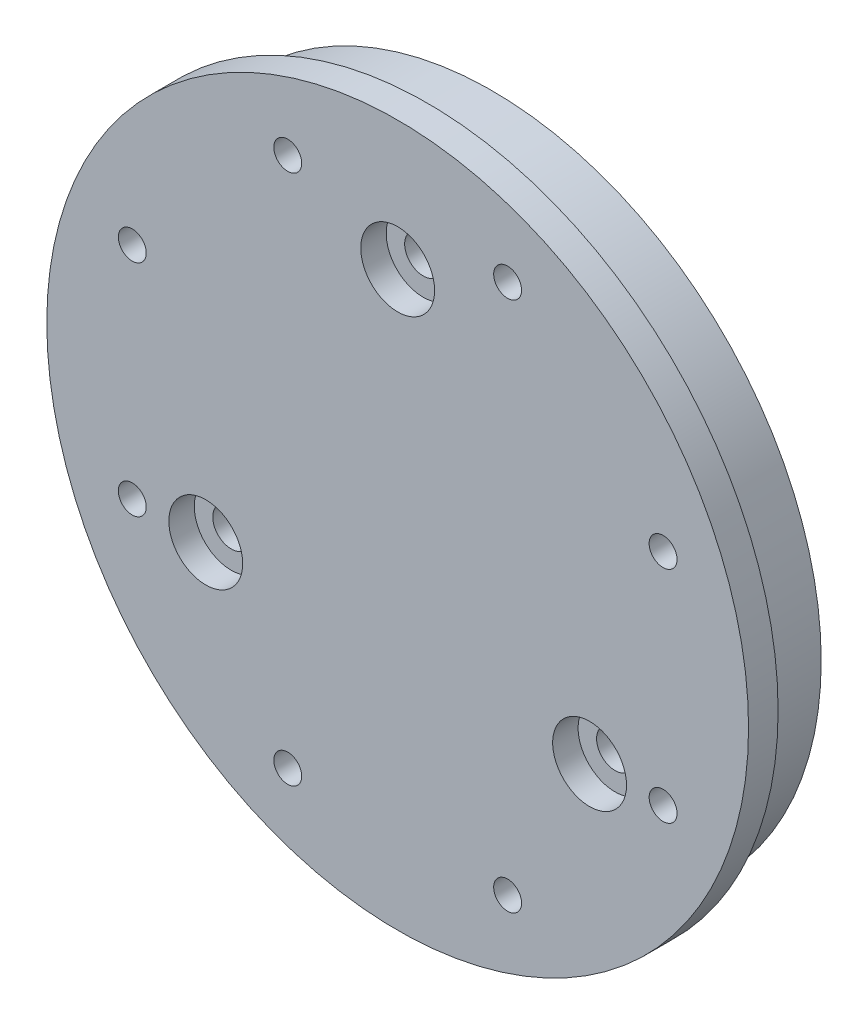
ISO-10303-21;
HEADER;
FILE_DESCRIPTION(('STEP AP214'),'2;1');
FILE_NAME('part.step','',(''),(''),'','','');
FILE_SCHEMA(('AUTOMOTIVE_DESIGN { 1 0 10303 214 1 1 1 1 }'));
ENDSEC;
DATA;
#1=APPLICATION_CONTEXT('core data for automotive mechanical design processes');
#2=APPLICATION_PROTOCOL_DEFINITION('international standard','automotive_design',2000,#1);
#3=PRODUCT_CONTEXT('',#1,'mechanical');
#4=PRODUCT('Part','Part','',(#3));
#5=PRODUCT_RELATED_PRODUCT_CATEGORY('part','',(#4));
#6=PRODUCT_DEFINITION_FORMATION('','',#4);
#7=PRODUCT_DEFINITION_CONTEXT('part definition',#1,'design');
#8=PRODUCT_DEFINITION('design','',#6,#7);
#9=PRODUCT_DEFINITION_SHAPE('','',#8);
#10=(LENGTH_UNIT() NAMED_UNIT(*) SI_UNIT(.MILLI.,.METRE.));
#11=(NAMED_UNIT(*) PLANE_ANGLE_UNIT() SI_UNIT($,.RADIAN.));
#12=(NAMED_UNIT(*) SI_UNIT($,.STERADIAN.) SOLID_ANGLE_UNIT());
#13=UNCERTAINTY_MEASURE_WITH_UNIT(LENGTH_MEASURE(1.E-05),#10,'distance_accuracy_value','');
#14=(GEOMETRIC_REPRESENTATION_CONTEXT(3) GLOBAL_UNCERTAINTY_ASSIGNED_CONTEXT((#13)) GLOBAL_UNIT_ASSIGNED_CONTEXT((#10,
#11,#12)) REPRESENTATION_CONTEXT('',''));
#15=CARTESIAN_POINT('',(0.,0.,0.));
#16=DIRECTION('',(0.,0.,1.));
#17=DIRECTION('',(1.,0.,0.));
#18=AXIS2_PLACEMENT_3D('',#15,#16,#17);
#19=CARTESIAN_POINT('',(0.,0.,-3.95));
#20=DIRECTION('',(0.,0.,1.));
#21=DIRECTION('',(1.,0.,0.));
#22=AXIS2_PLACEMENT_3D('',#19,#20,#21);
#23=PLANE('',#22);
#24=CARTESIAN_POINT('',(13.3939201327779,32.3357836378951,-3.95));
#25=DIRECTION('',(0.,0.,1.));
#26=DIRECTION('',(1.,0.,0.));
#27=AXIS2_PLACEMENT_3D('',#24,#25,#26);
#28=CIRCLE('',#27,1.69999999999999);
#29=CARTESIAN_POINT('',(15.0939201327779,32.3357836378951,-3.95));
#30=VERTEX_POINT('',#29);
#31=EDGE_CURVE('E606',#30,#30,#28,.T.);
#32=ORIENTED_EDGE('',*,*,#31,.T.);
#33=EDGE_LOOP('',(#32));
#34=FACE_BOUND('',#33,.T.);
#35=CARTESIAN_POINT('',(32.335783637895,13.3939201327783,-3.95));
#36=DIRECTION('',(0.,0.,1.));
#37=DIRECTION('',(1.,0.,0.));
#38=AXIS2_PLACEMENT_3D('',#35,#36,#37);
#39=CIRCLE('',#38,1.69999999999999);
#40=CARTESIAN_POINT('',(34.035783637895,13.3939201327783,-3.95));
#41=VERTEX_POINT('',#40);
#42=EDGE_CURVE('E600',#41,#41,#39,.T.);
#43=ORIENTED_EDGE('',*,*,#42,.T.);
#44=EDGE_LOOP('',(#43));
#45=FACE_BOUND('',#44,.T.);
#46=CARTESIAN_POINT('',(32.3357836378951,-13.3939201327779,-3.95));
#47=DIRECTION('',(0.,0.,1.));
#48=DIRECTION('',(1.,0.,0.));
#49=AXIS2_PLACEMENT_3D('',#46,#47,#48);
#50=CIRCLE('',#49,1.69999999999999);
#51=CARTESIAN_POINT('',(34.0357836378951,-13.3939201327779,-3.95));
#52=VERTEX_POINT('',#51);
#53=EDGE_CURVE('E594',#52,#52,#50,.T.);
#54=ORIENTED_EDGE('',*,*,#53,.T.);
#55=EDGE_LOOP('',(#54));
#56=FACE_BOUND('',#55,.T.);
#57=CARTESIAN_POINT('',(13.3939201327783,-32.3357836378949,-3.95));
#58=DIRECTION('',(0.,0.,1.));
#59=DIRECTION('',(1.,0.,0.));
#60=AXIS2_PLACEMENT_3D('',#57,#58,#59);
#61=CIRCLE('',#60,1.69999999999999);
#62=CARTESIAN_POINT('',(15.0939201327783,-32.3357836378949,-3.95));
#63=VERTEX_POINT('',#62);
#64=EDGE_CURVE('E588',#63,#63,#61,.T.);
#65=ORIENTED_EDGE('',*,*,#64,.T.);
#66=EDGE_LOOP('',(#65));
#67=FACE_BOUND('',#66,.T.);
#68=CARTESIAN_POINT('',(-13.3939201327779,-32.3357836378951,-3.95));
#69=DIRECTION('',(0.,0.,1.));
#70=DIRECTION('',(1.,0.,0.));
#71=AXIS2_PLACEMENT_3D('',#68,#69,#70);
#72=CIRCLE('',#71,1.69999999999999);
#73=CARTESIAN_POINT('',(-11.6939201327779,-32.3357836378951,-3.95));
#74=VERTEX_POINT('',#73);
#75=EDGE_CURVE('E582',#74,#74,#72,.T.);
#76=ORIENTED_EDGE('',*,*,#75,.T.);
#77=EDGE_LOOP('',(#76));
#78=FACE_BOUND('',#77,.T.);
#79=CARTESIAN_POINT('',(-32.3357836378949,-13.3939201327784,-3.95));
#80=DIRECTION('',(0.,0.,1.));
#81=DIRECTION('',(1.,0.,0.));
#82=AXIS2_PLACEMENT_3D('',#79,#80,#81);
#83=CIRCLE('',#82,1.69999999999999);
#84=CARTESIAN_POINT('',(-30.635783637895,-13.3939201327784,-3.95));
#85=VERTEX_POINT('',#84);
#86=EDGE_CURVE('E576',#85,#85,#83,.T.);
#87=ORIENTED_EDGE('',*,*,#86,.T.);
#88=EDGE_LOOP('',(#87));
#89=FACE_BOUND('',#88,.T.);
#90=CARTESIAN_POINT('',(-32.3357836378951,13.3939201327779,-3.95));
#91=DIRECTION('',(0.,0.,1.));
#92=DIRECTION('',(1.,0.,0.));
#93=AXIS2_PLACEMENT_3D('',#90,#91,#92);
#94=CIRCLE('',#93,1.69999999999999);
#95=CARTESIAN_POINT('',(-30.6357836378951,13.3939201327779,-3.95));
#96=VERTEX_POINT('',#95);
#97=EDGE_CURVE('E570',#96,#96,#94,.T.);
#98=ORIENTED_EDGE('',*,*,#97,.T.);
#99=EDGE_LOOP('',(#98));
#100=FACE_BOUND('',#99,.T.);
#101=CARTESIAN_POINT('',(-13.3939201327783,32.335783637895,-3.95));
#102=DIRECTION('',(0.,0.,1.));
#103=DIRECTION('',(1.,0.,0.));
#104=AXIS2_PLACEMENT_3D('',#101,#102,#103);
#105=CIRCLE('',#104,1.69999999999999);
#106=CARTESIAN_POINT('',(-11.6939201327784,32.335783637895,-3.95));
#107=VERTEX_POINT('',#106);
#108=EDGE_CURVE('E504',#107,#107,#105,.T.);
#109=ORIENTED_EDGE('',*,*,#108,.T.);
#110=EDGE_LOOP('',(#109));
#111=FACE_BOUND('',#110,.T.);
#112=CARTESIAN_POINT('',(0.,0.,-3.95));
#113=DIRECTION('',(0.,0.,1.));
#114=DIRECTION('',(1.,0.,0.));
#115=AXIS2_PLACEMENT_3D('',#112,#113,#114);
#116=CIRCLE('',#115,40.1);
#117=CARTESIAN_POINT('',(40.1,0.,-3.95));
#118=VERTEX_POINT('',#117);
#119=EDGE_CURVE('E37',#118,#118,#116,.T.);
#120=ORIENTED_EDGE('',*,*,#119,.F.);
#121=EDGE_LOOP('',(#120));
#122=FACE_BOUND('',#121,.T.);
#123=CARTESIAN_POINT('',(-23.3826859021776,-13.5000000000013,-3.95));
#124=DIRECTION('',(0.,0.,1.));
#125=DIRECTION('',(1.,0.,0.));
#126=AXIS2_PLACEMENT_3D('',#123,#124,#125);
#127=CIRCLE('',#126,2.25);
#128=CARTESIAN_POINT('',(-21.1326859021776,-13.5000000000013,-3.95));
#129=VERTEX_POINT('',#128);
#130=EDGE_CURVE('E163',#129,#129,#127,.T.);
#131=ORIENTED_EDGE('',*,*,#130,.T.);
#132=EDGE_LOOP('',(#131));
#133=FACE_BOUND('',#132,.T.);
#134=CARTESIAN_POINT('',(23.3826859021821,-13.4999999999987,-3.95));
#135=DIRECTION('',(0.,0.,1.));
#136=DIRECTION('',(1.,0.,0.));
#137=AXIS2_PLACEMENT_3D('',#134,#135,#136);
#138=CIRCLE('',#137,2.25);
#139=CARTESIAN_POINT('',(25.6326859021821,-13.4999999999987,-3.95));
#140=VERTEX_POINT('',#139);
#141=EDGE_CURVE('E151',#140,#140,#138,.T.);
#142=ORIENTED_EDGE('',*,*,#141,.T.);
#143=EDGE_LOOP('',(#142));
#144=FACE_BOUND('',#143,.T.);
#145=CARTESIAN_POINT('',(0.,27.,-3.95));
#146=DIRECTION('',(0.,0.,1.));
#147=DIRECTION('',(1.,0.,0.));
#148=AXIS2_PLACEMENT_3D('',#145,#146,#147);
#149=CIRCLE('',#148,2.25);
#150=CARTESIAN_POINT('',(2.25,27.,-3.95));
#151=VERTEX_POINT('',#150);
#152=EDGE_CURVE('E139',#151,#151,#149,.T.);
#153=ORIENTED_EDGE('',*,*,#152,.T.);
#154=EDGE_LOOP('',(#153));
#155=FACE_BOUND('',#154,.T.);
#156=DIRECTION('',(1.,0.,0.));
#157=VECTOR('',#156,1.);
#158=CARTESIAN_POINT('',(-5.,20.,-3.95));
#159=LINE('',#158,#157);
#160=CARTESIAN_POINT('',(-5.,20.,-3.95));
#161=VERTEX_POINT('',#160);
#162=CARTESIAN_POINT('',(5.,20.,-3.95));
#163=VERTEX_POINT('',#162);
#164=EDGE_CURVE('E124',#161,#163,#159,.T.);
#165=ORIENTED_EDGE('',*,*,#164,.F.);
#166=DIRECTION('',(0.,1.,0.));
#167=VECTOR('',#166,1.);
#168=CARTESIAN_POINT('',(-5.,20.,-3.95));
#169=LINE('',#168,#167);
#170=CARTESIAN_POINT('',(-5.,2.88675134594814,-3.95));
#171=VERTEX_POINT('',#170);
#172=EDGE_CURVE('E121',#171,#161,#169,.T.);
#173=ORIENTED_EDGE('',*,*,#172,.F.);
#174=DIRECTION('',(0.86602540378444,0.499999999999998,0.));
#175=VECTOR('',#174,1.);
#176=CARTESIAN_POINT('',(-5.,2.88675134594814,-3.95));
#177=LINE('',#176,#175);
#178=CARTESIAN_POINT('',(-19.8205080756888,-5.66987298107775,-3.95));
#179=VERTEX_POINT('',#178);
#180=EDGE_CURVE('E510',#179,#171,#177,.T.);
#181=ORIENTED_EDGE('',*,*,#180,.F.);
#182=DIRECTION('',(-0.499999999999998,0.86602540378444,0.));
#183=VECTOR('',#182,1.);
#184=CARTESIAN_POINT('',(-14.8205080756888,-14.3301270189222,-3.95));
#185=LINE('',#184,#183);
#186=CARTESIAN_POINT('',(-14.8205080756888,-14.3301270189222,-3.95));
#187=VERTEX_POINT('',#186);
#188=EDGE_CURVE('E546',#187,#179,#185,.T.);
#189=ORIENTED_EDGE('',*,*,#188,.F.);
#190=DIRECTION('',(-0.86602540378444,-0.499999999999998,0.));
#191=VECTOR('',#190,1.);
#192=CARTESIAN_POINT('',(0.,-5.77350269189625,-3.95));
#193=LINE('',#192,#191);
#194=CARTESIAN_POINT('',(0.,-5.77350269189625,-3.95));
#195=VERTEX_POINT('',#194);
#196=EDGE_CURVE('E543',#195,#187,#193,.T.);
#197=ORIENTED_EDGE('',*,*,#196,.F.);
#198=DIRECTION('',(-0.86602540378444,0.499999999999998,0.));
#199=VECTOR('',#198,1.);
#200=CARTESIAN_POINT('',(0.,-5.77350269189625,-3.95));
#201=LINE('',#200,#199);
#202=CARTESIAN_POINT('',(14.8205080756888,-14.3301270189222,-3.95));
#203=VERTEX_POINT('',#202);
#204=EDGE_CURVE('E537',#203,#195,#201,.T.);
#205=ORIENTED_EDGE('',*,*,#204,.F.);
#206=DIRECTION('',(-0.499999999999998,-0.86602540378444,0.));
#207=VECTOR('',#206,1.);
#208=CARTESIAN_POINT('',(19.8205080756888,-5.66987298107776,-3.95));
#209=LINE('',#208,#207);
#210=CARTESIAN_POINT('',(19.8205080756888,-5.66987298107776,-3.95));
#211=VERTEX_POINT('',#210);
#212=EDGE_CURVE('E534',#211,#203,#209,.T.);
#213=ORIENTED_EDGE('',*,*,#212,.F.);
#214=DIRECTION('',(0.86602540378444,-0.499999999999998,0.));
#215=VECTOR('',#214,1.);
#216=CARTESIAN_POINT('',(5.,2.88675134594813,-3.95));
#217=LINE('',#216,#215);
#218=CARTESIAN_POINT('',(5.,2.88675134594813,-3.95));
#219=VERTEX_POINT('',#218);
#220=EDGE_CURVE('E53',#219,#211,#217,.T.);
#221=ORIENTED_EDGE('',*,*,#220,.F.);
#222=DIRECTION('',(0.,-1.,0.));
#223=VECTOR('',#222,1.);
#224=CARTESIAN_POINT('',(5.,20.,-3.95));
#225=LINE('',#224,#223);
#226=EDGE_CURVE('E48',#163,#219,#225,.T.);
#227=ORIENTED_EDGE('',*,*,#226,.F.);
#228=EDGE_LOOP('',(#165,#173,#181,#189,#197,#205,#213,#221,#227));
#229=FACE_BOUND('',#228,.T.);
#230=ADVANCED_FACE('F33',(#34,#45,#56,#67,#78,#89,#100,#111,#122,#133,#144,#155,#229),#23,.F.);
#231=CARTESIAN_POINT('',(0.,0.,3.95));
#232=DIRECTION('',(0.,0.,-1.));
#233=DIRECTION('',(-1.,0.,0.));
#234=AXIS2_PLACEMENT_3D('',#231,#232,#233);
#235=CYLINDRICAL_SURFACE('',#234,40.1);
#236=CARTESIAN_POINT('',(0.,0.,3.95));
#237=DIRECTION('',(0.,0.,1.));
#238=DIRECTION('',(1.,0.,0.));
#239=AXIS2_PLACEMENT_3D('',#236,#237,#238);
#240=CIRCLE('',#239,40.1);
#241=CARTESIAN_POINT('',(40.1,0.,3.95));
#242=VERTEX_POINT('',#241);
#243=EDGE_CURVE('E11',#242,#242,#240,.T.);
#244=ORIENTED_EDGE('',*,*,#243,.F.);
#245=EDGE_LOOP('',(#244));
#246=FACE_BOUND('',#245,.T.);
#247=ORIENTED_EDGE('',*,*,#119,.T.);
#248=EDGE_LOOP('',(#247));
#249=FACE_BOUND('',#248,.T.);
#250=ADVANCED_FACE('F35',(#246,#249),#235,.T.);
#251=CARTESIAN_POINT('',(0.,0.,7.55));
#252=DIRECTION('',(0.,0.,-1.));
#253=DIRECTION('',(-1.,0.,0.));
#254=AXIS2_PLACEMENT_3D('',#251,#252,#253);
#255=CYLINDRICAL_SURFACE('',#254,42.75);
#256=CARTESIAN_POINT('',(0.,0.,7.55));
#257=DIRECTION('',(0.,0.,1.));
#258=DIRECTION('',(1.,0.,0.));
#259=AXIS2_PLACEMENT_3D('',#256,#257,#258);
#260=CIRCLE('',#259,42.75);
#261=CARTESIAN_POINT('',(42.75,0.,7.55));
#262=VERTEX_POINT('',#261);
#263=EDGE_CURVE('E167',#262,#262,#260,.T.);
#264=ORIENTED_EDGE('',*,*,#263,.F.);
#265=EDGE_LOOP('',(#264));
#266=FACE_BOUND('',#265,.T.);
#267=CARTESIAN_POINT('',(0.,0.,3.95));
#268=DIRECTION('',(0.,0.,1.));
#269=DIRECTION('',(1.,0.,0.));
#270=AXIS2_PLACEMENT_3D('',#267,#268,#269);
#271=CIRCLE('',#270,42.75);
#272=CARTESIAN_POINT('',(42.75,0.,3.95));
#273=VERTEX_POINT('',#272);
#274=EDGE_CURVE('E166',#273,#273,#271,.T.);
#275=ORIENTED_EDGE('',*,*,#274,.T.);
#276=EDGE_LOOP('',(#275));
#277=FACE_BOUND('',#276,.T.);
#278=ADVANCED_FACE('F173',(#266,#277),#255,.T.);
#279=CARTESIAN_POINT('',(0.,0.,7.55));
#280=DIRECTION('',(0.,0.,1.));
#281=DIRECTION('',(1.,0.,0.));
#282=AXIS2_PLACEMENT_3D('',#279,#280,#281);
#283=PLANE('',#282);
#284=CARTESIAN_POINT('',(13.3939201327779,32.3357836378951,7.55));
#285=DIRECTION('',(0.,0.,1.));
#286=DIRECTION('',(1.,0.,0.));
#287=AXIS2_PLACEMENT_3D('',#284,#285,#286);
#288=CIRCLE('',#287,1.69999999999999);
#289=CARTESIAN_POINT('',(15.0939201327779,32.3357836378951,7.55));
#290=VERTEX_POINT('',#289);
#291=EDGE_CURVE('E608',#290,#290,#288,.T.);
#292=ORIENTED_EDGE('',*,*,#291,.F.);
#293=EDGE_LOOP('',(#292));
#294=FACE_BOUND('',#293,.T.);
#295=CARTESIAN_POINT('',(32.335783637895,13.3939201327783,7.55));
#296=DIRECTION('',(0.,0.,1.));
#297=DIRECTION('',(1.,0.,0.));
#298=AXIS2_PLACEMENT_3D('',#295,#296,#297);
#299=CIRCLE('',#298,1.69999999999999);
#300=CARTESIAN_POINT('',(34.0357836378949,13.3939201327783,7.55));
#301=VERTEX_POINT('',#300);
#302=EDGE_CURVE('E603',#301,#301,#299,.T.);
#303=ORIENTED_EDGE('',*,*,#302,.F.);
#304=EDGE_LOOP('',(#303));
#305=FACE_BOUND('',#304,.T.);
#306=CARTESIAN_POINT('',(32.3357836378951,-13.3939201327779,7.55));
#307=DIRECTION('',(0.,0.,1.));
#308=DIRECTION('',(1.,0.,0.));
#309=AXIS2_PLACEMENT_3D('',#306,#307,#308);
#310=CIRCLE('',#309,1.69999999999999);
#311=CARTESIAN_POINT('',(34.0357836378951,-13.3939201327779,7.55));
#312=VERTEX_POINT('',#311);
#313=EDGE_CURVE('E597',#312,#312,#310,.T.);
#314=ORIENTED_EDGE('',*,*,#313,.F.);
#315=EDGE_LOOP('',(#314));
#316=FACE_BOUND('',#315,.T.);
#317=CARTESIAN_POINT('',(13.3939201327783,-32.3357836378949,7.55));
#318=DIRECTION('',(0.,0.,1.));
#319=DIRECTION('',(1.,0.,0.));
#320=AXIS2_PLACEMENT_3D('',#317,#318,#319);
#321=CIRCLE('',#320,1.69999999999999);
#322=CARTESIAN_POINT('',(15.0939201327783,-32.3357836378949,7.55));
#323=VERTEX_POINT('',#322);
#324=EDGE_CURVE('E591',#323,#323,#321,.T.);
#325=ORIENTED_EDGE('',*,*,#324,.F.);
#326=EDGE_LOOP('',(#325));
#327=FACE_BOUND('',#326,.T.);
#328=CARTESIAN_POINT('',(-13.3939201327779,-32.3357836378951,7.55));
#329=DIRECTION('',(0.,0.,1.));
#330=DIRECTION('',(1.,0.,0.));
#331=AXIS2_PLACEMENT_3D('',#328,#329,#330);
#332=CIRCLE('',#331,1.69999999999999);
#333=CARTESIAN_POINT('',(-11.693920132778,-32.3357836378951,7.55));
#334=VERTEX_POINT('',#333);
#335=EDGE_CURVE('E585',#334,#334,#332,.T.);
#336=ORIENTED_EDGE('',*,*,#335,.F.);
#337=EDGE_LOOP('',(#336));
#338=FACE_BOUND('',#337,.T.);
#339=CARTESIAN_POINT('',(-32.3357836378949,-13.3939201327784,7.55));
#340=DIRECTION('',(0.,0.,1.));
#341=DIRECTION('',(1.,0.,0.));
#342=AXIS2_PLACEMENT_3D('',#339,#340,#341);
#343=CIRCLE('',#342,1.69999999999999);
#344=CARTESIAN_POINT('',(-30.635783637895,-13.3939201327784,7.55));
#345=VERTEX_POINT('',#344);
#346=EDGE_CURVE('E579',#345,#345,#343,.T.);
#347=ORIENTED_EDGE('',*,*,#346,.F.);
#348=EDGE_LOOP('',(#347));
#349=FACE_BOUND('',#348,.T.);
#350=CARTESIAN_POINT('',(-32.3357836378951,13.3939201327779,7.55));
#351=DIRECTION('',(0.,0.,1.));
#352=DIRECTION('',(1.,0.,0.));
#353=AXIS2_PLACEMENT_3D('',#350,#351,#352);
#354=CIRCLE('',#353,1.69999999999999);
#355=CARTESIAN_POINT('',(-30.6357836378951,13.3939201327779,7.55));
#356=VERTEX_POINT('',#355);
#357=EDGE_CURVE('E573',#356,#356,#354,.T.);
#358=ORIENTED_EDGE('',*,*,#357,.F.);
#359=EDGE_LOOP('',(#358));
#360=FACE_BOUND('',#359,.T.);
#361=CARTESIAN_POINT('',(-13.3939201327783,32.335783637895,7.55));
#362=DIRECTION('',(0.,0.,1.));
#363=DIRECTION('',(1.,0.,0.));
#364=AXIS2_PLACEMENT_3D('',#361,#362,#363);
#365=CIRCLE('',#364,1.69999999999999);
#366=CARTESIAN_POINT('',(-11.6939201327784,32.335783637895,7.55));
#367=VERTEX_POINT('',#366);
#368=EDGE_CURVE('E567',#367,#367,#365,.T.);
#369=ORIENTED_EDGE('',*,*,#368,.F.);
#370=EDGE_LOOP('',(#369));
#371=FACE_BOUND('',#370,.T.);
#372=CARTESIAN_POINT('',(0.,27.,7.55));
#373=DIRECTION('',(0.,0.,1.));
#374=DIRECTION('',(1.,0.,0.));
#375=AXIS2_PLACEMENT_3D('',#372,#373,#374);
#376=CIRCLE('',#375,4.5);
#377=CARTESIAN_POINT('',(4.5,27.,7.55));
#378=VERTEX_POINT('',#377);
#379=EDGE_CURVE('E125',#378,#378,#376,.T.);
#380=ORIENTED_EDGE('',*,*,#379,.F.);
#381=EDGE_LOOP('',(#380));
#382=FACE_BOUND('',#381,.T.);
#383=CARTESIAN_POINT('',(23.3826859021821,-13.4999999999987,7.55));
#384=DIRECTION('',(0.,0.,1.));
#385=DIRECTION('',(1.,0.,0.));
#386=AXIS2_PLACEMENT_3D('',#383,#384,#385);
#387=CIRCLE('',#386,4.5);
#388=CARTESIAN_POINT('',(27.8826859021821,-13.4999999999987,7.55));
#389=VERTEX_POINT('',#388);
#390=EDGE_CURVE('E142',#389,#389,#387,.T.);
#391=ORIENTED_EDGE('',*,*,#390,.F.);
#392=EDGE_LOOP('',(#391));
#393=FACE_BOUND('',#392,.T.);
#394=CARTESIAN_POINT('',(-23.3826859021776,-13.5000000000013,7.55));
#395=DIRECTION('',(0.,0.,1.));
#396=DIRECTION('',(1.,0.,0.));
#397=AXIS2_PLACEMENT_3D('',#394,#395,#396);
#398=CIRCLE('',#397,4.5);
#399=CARTESIAN_POINT('',(-18.8826859021776,-13.5000000000013,7.55));
#400=VERTEX_POINT('',#399);
#401=EDGE_CURVE('E154',#400,#400,#398,.T.);
#402=ORIENTED_EDGE('',*,*,#401,.F.);
#403=EDGE_LOOP('',(#402));
#404=FACE_BOUND('',#403,.T.);
#405=ORIENTED_EDGE('',*,*,#263,.T.);
#406=EDGE_LOOP('',(#405));
#407=FACE_BOUND('',#406,.T.);
#408=ADVANCED_FACE('F178',(#294,#305,#316,#327,#338,#349,#360,#371,#382,#393,#404,#407),#283,.T.);
#409=CARTESIAN_POINT('',(0.,0.,3.95));
#410=DIRECTION('',(0.,0.,1.));
#411=DIRECTION('',(1.,0.,0.));
#412=AXIS2_PLACEMENT_3D('',#409,#410,#411);
#413=PLANE('',#412);
#414=ORIENTED_EDGE('',*,*,#243,.T.);
#415=EDGE_LOOP('',(#414));
#416=FACE_BOUND('',#415,.T.);
#417=ORIENTED_EDGE('',*,*,#274,.F.);
#418=EDGE_LOOP('',(#417));
#419=FACE_BOUND('',#418,.T.);
#420=ADVANCED_FACE('F175',(#416,#419),#413,.F.);
#421=CARTESIAN_POINT('',(-23.3826859021776,-13.5000000000013,7.55));
#422=DIRECTION('',(0.,0.,1.));
#423=DIRECTION('',(1.,0.,0.));
#424=AXIS2_PLACEMENT_3D('',#421,#422,#423);
#425=CYLINDRICAL_SURFACE('',#424,2.25);
#426=ORIENTED_EDGE('',*,*,#130,.F.);
#427=EDGE_LOOP('',(#426));
#428=FACE_BOUND('',#427,.T.);
#429=CARTESIAN_POINT('',(-23.3826859021776,-13.5000000000013,4.45));
#430=DIRECTION('',(0.,0.,1.));
#431=DIRECTION('',(1.,0.,0.));
#432=AXIS2_PLACEMENT_3D('',#429,#430,#431);
#433=CIRCLE('',#432,2.25);
#434=CARTESIAN_POINT('',(-21.1326859021776,-13.5000000000013,4.45));
#435=VERTEX_POINT('',#434);
#436=EDGE_CURVE('E160',#435,#435,#433,.T.);
#437=ORIENTED_EDGE('',*,*,#436,.T.);
#438=EDGE_LOOP('',(#437));
#439=FACE_BOUND('',#438,.T.);
#440=ADVANCED_FACE('F177',(#428,#439),#425,.F.);
#441=CARTESIAN_POINT('',(-21.1326859021776,-13.5000000000013,4.45));
#442=DIRECTION('',(0.,0.,-1.));
#443=DIRECTION('',(-1.,0.,0.));
#444=AXIS2_PLACEMENT_3D('',#441,#442,#443);
#445=PLANE('',#444);
#446=ORIENTED_EDGE('',*,*,#436,.F.);
#447=EDGE_LOOP('',(#446));
#448=FACE_BOUND('',#447,.T.);
#449=CARTESIAN_POINT('',(-23.3826859021776,-13.5000000000013,4.45));
#450=DIRECTION('',(0.,0.,1.));
#451=DIRECTION('',(1.,0.,0.));
#452=AXIS2_PLACEMENT_3D('',#449,#450,#451);
#453=CIRCLE('',#452,4.5);
#454=CARTESIAN_POINT('',(-18.8826859021776,-13.5000000000013,4.45));
#455=VERTEX_POINT('',#454);
#456=EDGE_CURVE('E157',#455,#455,#453,.T.);
#457=ORIENTED_EDGE('',*,*,#456,.T.);
#458=EDGE_LOOP('',(#457));
#459=FACE_BOUND('',#458,.T.);
#460=ADVANCED_FACE('F185',(#448,#459),#445,.F.);
#461=CARTESIAN_POINT('',(-23.3826859021776,-13.5000000000013,7.55));
#462=DIRECTION('',(0.,0.,1.));
#463=DIRECTION('',(1.,0.,0.));
#464=AXIS2_PLACEMENT_3D('',#461,#462,#463);
#465=CYLINDRICAL_SURFACE('',#464,4.5);
#466=ORIENTED_EDGE('',*,*,#456,.F.);
#467=EDGE_LOOP('',(#466));
#468=FACE_BOUND('',#467,.T.);
#469=ORIENTED_EDGE('',*,*,#401,.T.);
#470=EDGE_LOOP('',(#469));
#471=FACE_BOUND('',#470,.T.);
#472=ADVANCED_FACE('F360',(#468,#471),#465,.F.);
#473=CARTESIAN_POINT('',(23.3826859021821,-13.4999999999987,7.55));
#474=DIRECTION('',(0.,0.,1.));
#475=DIRECTION('',(1.,0.,0.));
#476=AXIS2_PLACEMENT_3D('',#473,#474,#475);
#477=CYLINDRICAL_SURFACE('',#476,2.25);
#478=ORIENTED_EDGE('',*,*,#141,.F.);
#479=EDGE_LOOP('',(#478));
#480=FACE_BOUND('',#479,.T.);
#481=CARTESIAN_POINT('',(23.3826859021821,-13.4999999999987,4.45));
#482=DIRECTION('',(0.,0.,1.));
#483=DIRECTION('',(1.,0.,0.));
#484=AXIS2_PLACEMENT_3D('',#481,#482,#483);
#485=CIRCLE('',#484,2.25);
#486=CARTESIAN_POINT('',(25.6326859021821,-13.4999999999987,4.45));
#487=VERTEX_POINT('',#486);
#488=EDGE_CURVE('E148',#487,#487,#485,.T.);
#489=ORIENTED_EDGE('',*,*,#488,.T.);
#490=EDGE_LOOP('',(#489));
#491=FACE_BOUND('',#490,.T.);
#492=ADVANCED_FACE('F356',(#480,#491),#477,.F.);
#493=CARTESIAN_POINT('',(25.6326859021821,-13.4999999999987,4.45));
#494=DIRECTION('',(0.,0.,-1.));
#495=DIRECTION('',(-1.,0.,0.));
#496=AXIS2_PLACEMENT_3D('',#493,#494,#495);
#497=PLANE('',#496);
#498=ORIENTED_EDGE('',*,*,#488,.F.);
#499=EDGE_LOOP('',(#498));
#500=FACE_BOUND('',#499,.T.);
#501=CARTESIAN_POINT('',(23.3826859021821,-13.4999999999987,4.45));
#502=DIRECTION('',(0.,0.,1.));
#503=DIRECTION('',(1.,0.,0.));
#504=AXIS2_PLACEMENT_3D('',#501,#502,#503);
#505=CIRCLE('',#504,4.5);
#506=CARTESIAN_POINT('',(27.8826859021821,-13.4999999999987,4.45));
#507=VERTEX_POINT('',#506);
#508=EDGE_CURVE('E145',#507,#507,#505,.T.);
#509=ORIENTED_EDGE('',*,*,#508,.T.);
#510=EDGE_LOOP('',(#509));
#511=FACE_BOUND('',#510,.T.);
#512=ADVANCED_FACE('F352',(#500,#511),#497,.F.);
#513=CARTESIAN_POINT('',(23.3826859021821,-13.4999999999987,7.55));
#514=DIRECTION('',(0.,0.,1.));
#515=DIRECTION('',(1.,0.,0.));
#516=AXIS2_PLACEMENT_3D('',#513,#514,#515);
#517=CYLINDRICAL_SURFACE('',#516,4.5);
#518=ORIENTED_EDGE('',*,*,#508,.F.);
#519=EDGE_LOOP('',(#518));
#520=FACE_BOUND('',#519,.T.);
#521=ORIENTED_EDGE('',*,*,#390,.T.);
#522=EDGE_LOOP('',(#521));
#523=FACE_BOUND('',#522,.T.);
#524=ADVANCED_FACE('F348',(#520,#523),#517,.F.);
#525=CARTESIAN_POINT('',(0.,27.,7.55));
#526=DIRECTION('',(0.,0.,1.));
#527=DIRECTION('',(1.,0.,0.));
#528=AXIS2_PLACEMENT_3D('',#525,#526,#527);
#529=CYLINDRICAL_SURFACE('',#528,2.25);
#530=ORIENTED_EDGE('',*,*,#152,.F.);
#531=EDGE_LOOP('',(#530));
#532=FACE_BOUND('',#531,.T.);
#533=CARTESIAN_POINT('',(0.,27.,4.45));
#534=DIRECTION('',(0.,0.,1.));
#535=DIRECTION('',(1.,0.,0.));
#536=AXIS2_PLACEMENT_3D('',#533,#534,#535);
#537=CIRCLE('',#536,2.25);
#538=CARTESIAN_POINT('',(2.25,27.,4.45));
#539=VERTEX_POINT('',#538);
#540=EDGE_CURVE('E136',#539,#539,#537,.T.);
#541=ORIENTED_EDGE('',*,*,#540,.T.);
#542=EDGE_LOOP('',(#541));
#543=FACE_BOUND('',#542,.T.);
#544=ADVANCED_FACE('F344',(#532,#543),#529,.F.);
#545=CARTESIAN_POINT('',(2.25,27.,4.45));
#546=DIRECTION('',(0.,0.,-1.));
#547=DIRECTION('',(-1.,0.,0.));
#548=AXIS2_PLACEMENT_3D('',#545,#546,#547);
#549=PLANE('',#548);
#550=ORIENTED_EDGE('',*,*,#540,.F.);
#551=EDGE_LOOP('',(#550));
#552=FACE_BOUND('',#551,.T.);
#553=CARTESIAN_POINT('',(0.,27.,4.45));
#554=DIRECTION('',(0.,0.,1.));
#555=DIRECTION('',(1.,0.,0.));
#556=AXIS2_PLACEMENT_3D('',#553,#554,#555);
#557=CIRCLE('',#556,4.5);
#558=CARTESIAN_POINT('',(4.5,27.,4.45));
#559=VERTEX_POINT('',#558);
#560=EDGE_CURVE('E128',#559,#559,#557,.T.);
#561=ORIENTED_EDGE('',*,*,#560,.T.);
#562=EDGE_LOOP('',(#561));
#563=FACE_BOUND('',#562,.T.);
#564=ADVANCED_FACE('F340',(#552,#563),#549,.F.);
#565=CARTESIAN_POINT('',(0.,27.,7.55));
#566=DIRECTION('',(0.,0.,1.));
#567=DIRECTION('',(1.,0.,0.));
#568=AXIS2_PLACEMENT_3D('',#565,#566,#567);
#569=CYLINDRICAL_SURFACE('',#568,4.5);
#570=ORIENTED_EDGE('',*,*,#560,.F.);
#571=EDGE_LOOP('',(#570));
#572=FACE_BOUND('',#571,.T.);
#573=ORIENTED_EDGE('',*,*,#379,.T.);
#574=EDGE_LOOP('',(#573));
#575=FACE_BOUND('',#574,.T.);
#576=ADVANCED_FACE('F337',(#572,#575),#569,.F.);
#577=CARTESIAN_POINT('',(-5.,20.,-7.55));
#578=DIRECTION('',(0.,-1.,0.));
#579=DIRECTION('',(0.,0.,-1.));
#580=AXIS2_PLACEMENT_3D('',#577,#578,#579);
#581=PLANE('',#580);
#582=ORIENTED_EDGE('',*,*,#164,.T.);
#583=DIRECTION('',(0.,0.,1.));
#584=VECTOR('',#583,1.);
#585=CARTESIAN_POINT('',(5.,20.,-7.55));
#586=LINE('',#585,#584);
#587=CARTESIAN_POINT('',(5.,20.,-7.55));
#588=VERTEX_POINT('',#587);
#589=EDGE_CURVE('E105',#588,#163,#586,.T.);
#590=ORIENTED_EDGE('',*,*,#589,.F.);
#591=DIRECTION('',(1.,0.,0.));
#592=VECTOR('',#591,1.);
#593=CARTESIAN_POINT('',(-5.,20.,-7.55));
#594=LINE('',#593,#592);
#595=CARTESIAN_POINT('',(-5.,20.,-7.55));
#596=VERTEX_POINT('',#595);
#597=EDGE_CURVE('E112',#596,#588,#594,.T.);
#598=ORIENTED_EDGE('',*,*,#597,.F.);
#599=DIRECTION('',(0.,0.,1.));
#600=VECTOR('',#599,1.);
#601=CARTESIAN_POINT('',(-5.,20.,-7.55));
#602=LINE('',#601,#600);
#603=EDGE_CURVE('E507',#596,#161,#602,.T.);
#604=ORIENTED_EDGE('',*,*,#603,.T.);
#605=EDGE_LOOP('',(#582,#590,#598,#604));
#606=FACE_BOUND('',#605,.T.);
#607=ADVANCED_FACE('F123',(#606),#581,.F.);
#608=CARTESIAN_POINT('',(5.,20.,-7.55));
#609=DIRECTION('',(-1.,0.,0.));
#610=DIRECTION('',(0.,-1.,0.));
#611=AXIS2_PLACEMENT_3D('',#608,#609,#610);
#612=PLANE('',#611);
#613=ORIENTED_EDGE('',*,*,#226,.T.);
#614=DIRECTION('',(0.,0.,1.));
#615=VECTOR('',#614,1.);
#616=CARTESIAN_POINT('',(5.,2.88675134594813,-7.55));
#617=LINE('',#616,#615);
#618=CARTESIAN_POINT('',(5.,2.88675134594813,-7.55));
#619=VERTEX_POINT('',#618);
#620=EDGE_CURVE('E108',#619,#219,#617,.T.);
#621=ORIENTED_EDGE('',*,*,#620,.F.);
#622=DIRECTION('',(0.,-1.,0.));
#623=VECTOR('',#622,1.);
#624=CARTESIAN_POINT('',(5.,20.,-7.55));
#625=LINE('',#624,#623);
#626=EDGE_CURVE('E101',#588,#619,#625,.T.);
#627=ORIENTED_EDGE('',*,*,#626,.F.);
#628=ORIENTED_EDGE('',*,*,#589,.T.);
#629=EDGE_LOOP('',(#613,#621,#627,#628));
#630=FACE_BOUND('',#629,.T.);
#631=ADVANCED_FACE('F103',(#630),#612,.F.);
#632=CARTESIAN_POINT('',(5.,2.88675134594813,-7.55));
#633=DIRECTION('',(-0.499999999999998,-0.86602540378444,0.));
#634=DIRECTION('',(0.86602540378444,-0.499999999999998,0.));
#635=AXIS2_PLACEMENT_3D('',#632,#633,#634);
#636=PLANE('',#635);
#637=ORIENTED_EDGE('',*,*,#220,.T.);
#638=DIRECTION('',(0.,0.,1.));
#639=VECTOR('',#638,1.);
#640=CARTESIAN_POINT('',(19.8205080756888,-5.66987298107776,-7.55));
#641=LINE('',#640,#639);
#642=CARTESIAN_POINT('',(19.8205080756888,-5.66987298107776,-7.55));
#643=VERTEX_POINT('',#642);
#644=EDGE_CURVE('E130',#643,#211,#641,.T.);
#645=ORIENTED_EDGE('',*,*,#644,.F.);
#646=DIRECTION('',(0.86602540378444,-0.499999999999998,0.));
#647=VECTOR('',#646,1.);
#648=CARTESIAN_POINT('',(5.,2.88675134594813,-7.55));
#649=LINE('',#648,#647);
#650=EDGE_CURVE('E111',#619,#643,#649,.T.);
#651=ORIENTED_EDGE('',*,*,#650,.F.);
#652=ORIENTED_EDGE('',*,*,#620,.T.);
#653=EDGE_LOOP('',(#637,#645,#651,#652));
#654=FACE_BOUND('',#653,.T.);
#655=ADVANCED_FACE('F328',(#654),#636,.F.);
#656=CARTESIAN_POINT('',(19.8205080756888,-5.66987298107776,-7.55));
#657=DIRECTION('',(-0.86602540378444,0.499999999999998,0.));
#658=DIRECTION('',(-0.499999999999998,-0.86602540378444,0.));
#659=AXIS2_PLACEMENT_3D('',#656,#657,#658);
#660=PLANE('',#659);
#661=ORIENTED_EDGE('',*,*,#212,.T.);
#662=DIRECTION('',(0.,0.,1.));
#663=VECTOR('',#662,1.);
#664=CARTESIAN_POINT('',(14.8205080756888,-14.3301270189222,-7.55));
#665=LINE('',#664,#663);
#666=CARTESIAN_POINT('',(14.8205080756888,-14.3301270189222,-7.55));
#667=VERTEX_POINT('',#666);
#668=EDGE_CURVE('E527',#667,#203,#665,.T.);
#669=ORIENTED_EDGE('',*,*,#668,.F.);
#670=DIRECTION('',(-0.499999999999998,-0.86602540378444,0.));
#671=VECTOR('',#670,1.);
#672=CARTESIAN_POINT('',(19.8205080756888,-5.66987298107776,-7.55));
#673=LINE('',#672,#671);
#674=EDGE_CURVE('E535',#643,#667,#673,.T.);
#675=ORIENTED_EDGE('',*,*,#674,.F.);
#676=ORIENTED_EDGE('',*,*,#644,.T.);
#677=EDGE_LOOP('',(#661,#669,#675,#676));
#678=FACE_BOUND('',#677,.T.);
#679=ADVANCED_FACE('F324',(#678),#660,.F.);
#680=CARTESIAN_POINT('',(0.,-5.77350269189625,-7.55));
#681=DIRECTION('',(0.499999999999998,0.86602540378444,0.));
#682=DIRECTION('',(-0.86602540378444,0.499999999999998,0.));
#683=AXIS2_PLACEMENT_3D('',#680,#681,#682);
#684=PLANE('',#683);
#685=ORIENTED_EDGE('',*,*,#204,.T.);
#686=DIRECTION('',(0.,0.,1.));
#687=VECTOR('',#686,1.);
#688=CARTESIAN_POINT('',(0.,-5.77350269189625,-7.55));
#689=LINE('',#688,#687);
#690=CARTESIAN_POINT('',(0.,-5.77350269189625,-7.55));
#691=VERTEX_POINT('',#690);
#692=EDGE_CURVE('E524',#691,#195,#689,.T.);
#693=ORIENTED_EDGE('',*,*,#692,.F.);
#694=DIRECTION('',(-0.86602540378444,0.499999999999998,0.));
#695=VECTOR('',#694,1.);
#696=CARTESIAN_POINT('',(0.,-5.77350269189625,-7.55));
#697=LINE('',#696,#695);
#698=EDGE_CURVE('E557',#667,#691,#697,.T.);
#699=ORIENTED_EDGE('',*,*,#698,.F.);
#700=ORIENTED_EDGE('',*,*,#668,.T.);
#701=EDGE_LOOP('',(#685,#693,#699,#700));
#702=FACE_BOUND('',#701,.T.);
#703=ADVANCED_FACE('F320',(#702),#684,.F.);
#704=CARTESIAN_POINT('',(0.,-5.77350269189625,-7.55));
#705=DIRECTION('',(-0.499999999999998,0.86602540378444,0.));
#706=DIRECTION('',(-0.86602540378444,-0.499999999999998,0.));
#707=AXIS2_PLACEMENT_3D('',#704,#705,#706);
#708=PLANE('',#707);
#709=ORIENTED_EDGE('',*,*,#196,.T.);
#710=DIRECTION('',(0.,0.,1.));
#711=VECTOR('',#710,1.);
#712=CARTESIAN_POINT('',(-14.8205080756888,-14.3301270189222,-7.55));
#713=LINE('',#712,#711);
#714=CARTESIAN_POINT('',(-14.8205080756888,-14.3301270189222,-7.55));
#715=VERTEX_POINT('',#714);
#716=EDGE_CURVE('E521',#715,#187,#713,.T.);
#717=ORIENTED_EDGE('',*,*,#716,.F.);
#718=DIRECTION('',(-0.86602540378444,-0.499999999999998,0.));
#719=VECTOR('',#718,1.);
#720=CARTESIAN_POINT('',(0.,-5.77350269189625,-7.55));
#721=LINE('',#720,#719);
#722=EDGE_CURVE('E554',#691,#715,#721,.T.);
#723=ORIENTED_EDGE('',*,*,#722,.F.);
#724=ORIENTED_EDGE('',*,*,#692,.T.);
#725=EDGE_LOOP('',(#709,#717,#723,#724));
#726=FACE_BOUND('',#725,.T.);
#727=ADVANCED_FACE('F316',(#726),#708,.F.);
#728=CARTESIAN_POINT('',(-14.8205080756888,-14.3301270189222,-7.55));
#729=DIRECTION('',(0.86602540378444,0.499999999999998,0.));
#730=DIRECTION('',(-0.499999999999998,0.86602540378444,0.));
#731=AXIS2_PLACEMENT_3D('',#728,#729,#730);
#732=PLANE('',#731);
#733=ORIENTED_EDGE('',*,*,#188,.T.);
#734=DIRECTION('',(0.,0.,1.));
#735=VECTOR('',#734,1.);
#736=CARTESIAN_POINT('',(-19.8205080756888,-5.66987298107775,-7.55));
#737=LINE('',#736,#735);
#738=CARTESIAN_POINT('',(-19.8205080756888,-5.66987298107775,-7.55));
#739=VERTEX_POINT('',#738);
#740=EDGE_CURVE('E513',#739,#179,#737,.T.);
#741=ORIENTED_EDGE('',*,*,#740,.F.);
#742=DIRECTION('',(-0.499999999999998,0.86602540378444,0.));
#743=VECTOR('',#742,1.);
#744=CARTESIAN_POINT('',(-14.8205080756888,-14.3301270189222,-7.55));
#745=LINE('',#744,#743);
#746=EDGE_CURVE('E552',#715,#739,#745,.T.);
#747=ORIENTED_EDGE('',*,*,#746,.F.);
#748=ORIENTED_EDGE('',*,*,#716,.T.);
#749=EDGE_LOOP('',(#733,#741,#747,#748));
#750=FACE_BOUND('',#749,.T.);
#751=ADVANCED_FACE('F312',(#750),#732,.F.);
#752=CARTESIAN_POINT('',(-5.,2.88675134594814,-7.55));
#753=DIRECTION('',(0.499999999999998,-0.86602540378444,0.));
#754=DIRECTION('',(0.86602540378444,0.499999999999998,0.));
#755=AXIS2_PLACEMENT_3D('',#752,#753,#754);
#756=PLANE('',#755);
#757=ORIENTED_EDGE('',*,*,#180,.T.);
#758=DIRECTION('',(0.,0.,1.));
#759=VECTOR('',#758,1.);
#760=CARTESIAN_POINT('',(-5.,2.88675134594814,-7.55));
#761=LINE('',#760,#759);
#762=CARTESIAN_POINT('',(-5.,2.88675134594814,-7.55));
#763=VERTEX_POINT('',#762);
#764=EDGE_CURVE('E509',#763,#171,#761,.T.);
#765=ORIENTED_EDGE('',*,*,#764,.F.);
#766=DIRECTION('',(0.86602540378444,0.499999999999998,0.));
#767=VECTOR('',#766,1.);
#768=CARTESIAN_POINT('',(-5.,2.88675134594814,-7.55));
#769=LINE('',#768,#767);
#770=EDGE_CURVE('E515',#739,#763,#769,.T.);
#771=ORIENTED_EDGE('',*,*,#770,.F.);
#772=ORIENTED_EDGE('',*,*,#740,.T.);
#773=EDGE_LOOP('',(#757,#765,#771,#772));
#774=FACE_BOUND('',#773,.T.);
#775=ADVANCED_FACE('F308',(#774),#756,.F.);
#776=CARTESIAN_POINT('',(-5.,20.,-7.55));
#777=DIRECTION('',(1.,0.,0.));
#778=DIRECTION('',(0.,0.,-1.));
#779=AXIS2_PLACEMENT_3D('',#776,#777,#778);
#780=PLANE('',#779);
#781=ORIENTED_EDGE('',*,*,#172,.T.);
#782=ORIENTED_EDGE('',*,*,#603,.F.);
#783=DIRECTION('',(0.,1.,0.));
#784=VECTOR('',#783,1.);
#785=CARTESIAN_POINT('',(-5.,20.,-7.55));
#786=LINE('',#785,#784);
#787=EDGE_CURVE('E117',#763,#596,#786,.T.);
#788=ORIENTED_EDGE('',*,*,#787,.F.);
#789=ORIENTED_EDGE('',*,*,#764,.T.);
#790=EDGE_LOOP('',(#781,#782,#788,#789));
#791=FACE_BOUND('',#790,.T.);
#792=ADVANCED_FACE('F305',(#791),#780,.F.);
#793=CARTESIAN_POINT('',(0.,0.,-7.55));
#794=DIRECTION('',(0.,0.,-1.));
#795=DIRECTION('',(-1.,0.,0.));
#796=AXIS2_PLACEMENT_3D('',#793,#794,#795);
#797=PLANE('',#796);
#798=ORIENTED_EDGE('',*,*,#597,.T.);
#799=ORIENTED_EDGE('',*,*,#626,.T.);
#800=ORIENTED_EDGE('',*,*,#650,.T.);
#801=ORIENTED_EDGE('',*,*,#674,.T.);
#802=ORIENTED_EDGE('',*,*,#698,.T.);
#803=ORIENTED_EDGE('',*,*,#722,.T.);
#804=ORIENTED_EDGE('',*,*,#746,.T.);
#805=ORIENTED_EDGE('',*,*,#770,.T.);
#806=ORIENTED_EDGE('',*,*,#787,.T.);
#807=EDGE_LOOP('',(#798,#799,#800,#801,#802,#803,#804,#805,#806));
#808=FACE_BOUND('',#807,.T.);
#809=ADVANCED_FACE('F115',(#808),#797,.T.);
#810=CARTESIAN_POINT('',(-13.3939201327783,32.335783637895,7.55));
#811=DIRECTION('',(0.,0.,1.));
#812=DIRECTION('',(1.,0.,0.));
#813=AXIS2_PLACEMENT_3D('',#810,#811,#812);
#814=CYLINDRICAL_SURFACE('',#813,1.69999999999999);
#815=ORIENTED_EDGE('',*,*,#108,.F.);
#816=EDGE_LOOP('',(#815));
#817=FACE_BOUND('',#816,.T.);
#818=ORIENTED_EDGE('',*,*,#368,.T.);
#819=EDGE_LOOP('',(#818));
#820=FACE_BOUND('',#819,.T.);
#821=ADVANCED_FACE('F220',(#817,#820),#814,.F.);
#822=CARTESIAN_POINT('',(-32.3357836378951,13.3939201327779,7.55));
#823=DIRECTION('',(0.,0.,1.));
#824=DIRECTION('',(1.,0.,0.));
#825=AXIS2_PLACEMENT_3D('',#822,#823,#824);
#826=CYLINDRICAL_SURFACE('',#825,1.69999999999999);
#827=ORIENTED_EDGE('',*,*,#97,.F.);
#828=EDGE_LOOP('',(#827));
#829=FACE_BOUND('',#828,.T.);
#830=ORIENTED_EDGE('',*,*,#357,.T.);
#831=EDGE_LOOP('',(#830));
#832=FACE_BOUND('',#831,.T.);
#833=ADVANCED_FACE('F225',(#829,#832),#826,.F.);
#834=CARTESIAN_POINT('',(-32.3357836378949,-13.3939201327784,7.55));
#835=DIRECTION('',(0.,0.,1.));
#836=DIRECTION('',(1.,0.,0.));
#837=AXIS2_PLACEMENT_3D('',#834,#835,#836);
#838=CYLINDRICAL_SURFACE('',#837,1.69999999999999);
#839=ORIENTED_EDGE('',*,*,#86,.F.);
#840=EDGE_LOOP('',(#839));
#841=FACE_BOUND('',#840,.T.);
#842=ORIENTED_EDGE('',*,*,#346,.T.);
#843=EDGE_LOOP('',(#842));
#844=FACE_BOUND('',#843,.T.);
#845=ADVANCED_FACE('F237',(#841,#844),#838,.F.);
#846=CARTESIAN_POINT('',(-13.3939201327779,-32.3357836378951,7.55));
#847=DIRECTION('',(0.,0.,1.));
#848=DIRECTION('',(1.,0.,0.));
#849=AXIS2_PLACEMENT_3D('',#846,#847,#848);
#850=CYLINDRICAL_SURFACE('',#849,1.69999999999999);
#851=ORIENTED_EDGE('',*,*,#75,.F.);
#852=EDGE_LOOP('',(#851));
#853=FACE_BOUND('',#852,.T.);
#854=ORIENTED_EDGE('',*,*,#335,.T.);
#855=EDGE_LOOP('',(#854));
#856=FACE_BOUND('',#855,.T.);
#857=ADVANCED_FACE('F247',(#853,#856),#850,.F.);
#858=CARTESIAN_POINT('',(13.3939201327783,-32.3357836378949,7.55));
#859=DIRECTION('',(0.,0.,1.));
#860=DIRECTION('',(1.,0.,0.));
#861=AXIS2_PLACEMENT_3D('',#858,#859,#860);
#862=CYLINDRICAL_SURFACE('',#861,1.69999999999999);
#863=ORIENTED_EDGE('',*,*,#64,.F.);
#864=EDGE_LOOP('',(#863));
#865=FACE_BOUND('',#864,.T.);
#866=ORIENTED_EDGE('',*,*,#324,.T.);
#867=EDGE_LOOP('',(#866));
#868=FACE_BOUND('',#867,.T.);
#869=ADVANCED_FACE('F257',(#865,#868),#862,.F.);
#870=CARTESIAN_POINT('',(32.3357836378951,-13.3939201327779,7.55));
#871=DIRECTION('',(0.,0.,1.));
#872=DIRECTION('',(1.,0.,0.));
#873=AXIS2_PLACEMENT_3D('',#870,#871,#872);
#874=CYLINDRICAL_SURFACE('',#873,1.69999999999999);
#875=ORIENTED_EDGE('',*,*,#53,.F.);
#876=EDGE_LOOP('',(#875));
#877=FACE_BOUND('',#876,.T.);
#878=ORIENTED_EDGE('',*,*,#313,.T.);
#879=EDGE_LOOP('',(#878));
#880=FACE_BOUND('',#879,.T.);
#881=ADVANCED_FACE('F267',(#877,#880),#874,.F.);
#882=CARTESIAN_POINT('',(32.335783637895,13.3939201327783,7.55));
#883=DIRECTION('',(0.,0.,1.));
#884=DIRECTION('',(1.,0.,0.));
#885=AXIS2_PLACEMENT_3D('',#882,#883,#884);
#886=CYLINDRICAL_SURFACE('',#885,1.69999999999999);
#887=ORIENTED_EDGE('',*,*,#42,.F.);
#888=EDGE_LOOP('',(#887));
#889=FACE_BOUND('',#888,.T.);
#890=ORIENTED_EDGE('',*,*,#302,.T.);
#891=EDGE_LOOP('',(#890));
#892=FACE_BOUND('',#891,.T.);
#893=ADVANCED_FACE('F277',(#889,#892),#886,.F.);
#894=CARTESIAN_POINT('',(13.3939201327779,32.3357836378951,7.55));
#895=DIRECTION('',(0.,0.,1.));
#896=DIRECTION('',(1.,0.,0.));
#897=AXIS2_PLACEMENT_3D('',#894,#895,#896);
#898=CYLINDRICAL_SURFACE('',#897,1.69999999999999);
#899=ORIENTED_EDGE('',*,*,#31,.F.);
#900=EDGE_LOOP('',(#899));
#901=FACE_BOUND('',#900,.T.);
#902=ORIENTED_EDGE('',*,*,#291,.T.);
#903=EDGE_LOOP('',(#902));
#904=FACE_BOUND('',#903,.T.);
#905=ADVANCED_FACE('F287',(#901,#904),#898,.F.);
#906=CLOSED_SHELL('',(#230,#250,#278,#408,#420,#440,#460,#472,#492,#512,#524,#544,#564,#576,
#607,#631,#655,#679,#703,#727,#751,#775,#792,#809,#821,#833,#845,#857,#869,#881,#893,#905));
#907=MANIFOLD_SOLID_BREP('B2',#906);
#908=ADVANCED_BREP_SHAPE_REPRESENTATION('',(#18,#907),#14);
#909=SHAPE_DEFINITION_REPRESENTATION(#9,#908);
ENDSEC;
END-ISO-10303-21;
